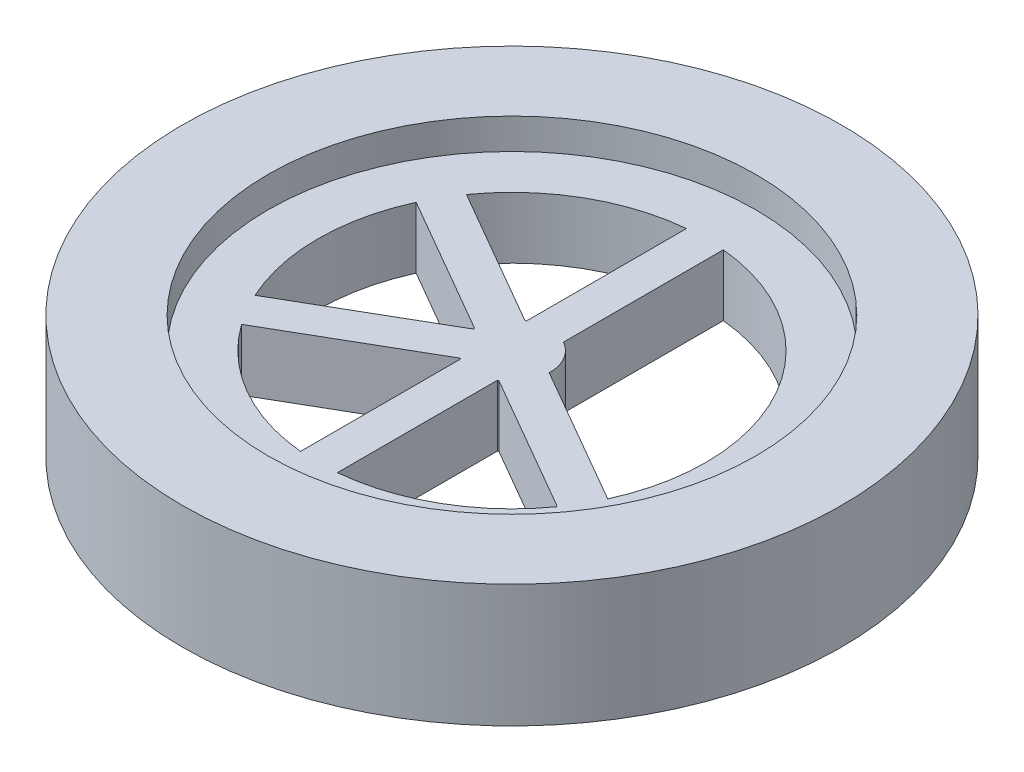
ISO-10303-21;
HEADER;
FILE_DESCRIPTION(('STEP AP214'),'2;1');
FILE_NAME('part.step','',(''),(''),'','','');
FILE_SCHEMA(('AUTOMOTIVE_DESIGN { 1 0 10303 214 1 1 1 1 }'));
ENDSEC;
DATA;
#1=APPLICATION_CONTEXT('core data for automotive mechanical design processes');
#2=APPLICATION_PROTOCOL_DEFINITION('international standard','automotive_design',2000,#1);
#3=PRODUCT_CONTEXT('',#1,'mechanical');
#4=PRODUCT('Part','Part','',(#3));
#5=PRODUCT_RELATED_PRODUCT_CATEGORY('part','',(#4));
#6=PRODUCT_DEFINITION_FORMATION('','',#4);
#7=PRODUCT_DEFINITION_CONTEXT('part definition',#1,'design');
#8=PRODUCT_DEFINITION('design','',#6,#7);
#9=PRODUCT_DEFINITION_SHAPE('','',#8);
#10=(LENGTH_UNIT() NAMED_UNIT(*) SI_UNIT(.MILLI.,.METRE.));
#11=(NAMED_UNIT(*) PLANE_ANGLE_UNIT() SI_UNIT($,.RADIAN.));
#12=(NAMED_UNIT(*) SI_UNIT($,.STERADIAN.) SOLID_ANGLE_UNIT());
#13=UNCERTAINTY_MEASURE_WITH_UNIT(LENGTH_MEASURE(1.E-05),#10,'distance_accuracy_value','');
#14=(GEOMETRIC_REPRESENTATION_CONTEXT(3) GLOBAL_UNCERTAINTY_ASSIGNED_CONTEXT((#13)) GLOBAL_UNIT_ASSIGNED_CONTEXT((#10,
#11,#12)) REPRESENTATION_CONTEXT('',''));
#15=CARTESIAN_POINT('',(0.,0.,0.));
#16=DIRECTION('',(0.,0.,1.));
#17=DIRECTION('',(1.,0.,0.));
#18=AXIS2_PLACEMENT_3D('',#15,#16,#17);
#19=CARTESIAN_POINT('',(0.,5.,0.));
#20=DIRECTION('',(0.,-1.,0.));
#21=DIRECTION('',(0.,0.,-1.));
#22=AXIS2_PLACEMENT_3D('',#19,#20,#21);
#23=CYLINDRICAL_SURFACE('',#22,31.5845753104006);
#24=CARTESIAN_POINT('',(0.,5.,0.));
#25=DIRECTION('',(0.,1.,0.));
#26=DIRECTION('',(0.,0.,1.));
#27=AXIS2_PLACEMENT_3D('',#24,#25,#26);
#28=CIRCLE('',#27,31.5845753104006);
#29=CARTESIAN_POINT('',(-3.,5.,-31.4417779004045));
#30=VERTEX_POINT('',#29);
#31=CARTESIAN_POINT('',(-25.7293784018985,5.,-18.3189651615555));
#32=VERTEX_POINT('',#31);
#33=EDGE_CURVE('E303',#30,#32,#28,.T.);
#34=ORIENTED_EDGE('',*,*,#33,.T.);
#35=DIRECTION('',(0.,-1.,0.));
#36=VECTOR('',#35,1.);
#37=CARTESIAN_POINT('',(-25.7293784018985,5.,-18.3189651615555));
#38=LINE('',#37,#36);
#39=CARTESIAN_POINT('',(-25.7293784018985,-5.,-18.3189651615555));
#40=VERTEX_POINT('',#39);
#41=EDGE_CURVE('E191',#32,#40,#38,.T.);
#42=ORIENTED_EDGE('',*,*,#41,.T.);
#43=CARTESIAN_POINT('',(0.,-5.,0.));
#44=DIRECTION('',(0.,1.,0.));
#45=DIRECTION('',(0.,0.,1.));
#46=AXIS2_PLACEMENT_3D('',#43,#44,#45);
#47=CIRCLE('',#46,31.5845753104006);
#48=CARTESIAN_POINT('',(-3.,-5.,-31.4417779004045));
#49=VERTEX_POINT('',#48);
#50=EDGE_CURVE('E311',#49,#40,#47,.T.);
#51=ORIENTED_EDGE('',*,*,#50,.F.);
#52=DIRECTION('',(0.,-1.,0.));
#53=VECTOR('',#52,1.);
#54=CARTESIAN_POINT('',(-3.,5.,-31.4417779004045));
#55=LINE('',#54,#53);
#56=EDGE_CURVE('E300',#49,#30,#55,.F.);
#57=ORIENTED_EDGE('',*,*,#56,.T.);
#58=EDGE_LOOP('',(#34,#42,#51,#57));
#59=FACE_BOUND('',#58,.T.);
#60=ADVANCED_FACE('F39',(#59),#23,.F.);
#61=CARTESIAN_POINT('',(-28.7293784018985,-5.,-13.1228127388489));
#62=VERTEX_POINT('',#61);
#63=CARTESIAN_POINT('',(-28.7293784018984,-5.,13.1228127388491));
#64=VERTEX_POINT('',#63);
#65=EDGE_CURVE('E316',#62,#64,#47,.T.);
#66=ORIENTED_EDGE('',*,*,#65,.F.);
#67=DIRECTION('',(0.,-1.,0.));
#68=VECTOR('',#67,1.);
#69=CARTESIAN_POINT('',(-28.7293784018985,5.,-13.1228127388489));
#70=LINE('',#69,#68);
#71=CARTESIAN_POINT('',(-28.7293784018985,5.,-13.1228127388489));
#72=VERTEX_POINT('',#71);
#73=EDGE_CURVE('E273',#62,#72,#70,.F.);
#74=ORIENTED_EDGE('',*,*,#73,.T.);
#75=CARTESIAN_POINT('',(-28.7293784018984,5.,13.1228127388491));
#76=VERTEX_POINT('',#75);
#77=EDGE_CURVE('E306',#72,#76,#28,.T.);
#78=ORIENTED_EDGE('',*,*,#77,.T.);
#79=DIRECTION('',(0.,-1.,0.));
#80=VECTOR('',#79,1.);
#81=CARTESIAN_POINT('',(-28.7293784018984,5.,13.1228127388491));
#82=LINE('',#81,#80);
#83=EDGE_CURVE('E266',#76,#64,#82,.T.);
#84=ORIENTED_EDGE('',*,*,#83,.T.);
#85=EDGE_LOOP('',(#66,#74,#78,#84));
#86=FACE_BOUND('',#85,.T.);
#87=ADVANCED_FACE('F344',(#86),#23,.F.);
#88=CARTESIAN_POINT('',(-25.7293784018984,5.,18.3189651615557));
#89=VERTEX_POINT('',#88);
#90=CARTESIAN_POINT('',(-3.,5.,31.4417779004045));
#91=VERTEX_POINT('',#90);
#92=EDGE_CURVE('E664',#89,#91,#28,.T.);
#93=ORIENTED_EDGE('',*,*,#92,.T.);
#94=DIRECTION('',(0.,-1.,0.));
#95=VECTOR('',#94,1.);
#96=CARTESIAN_POINT('',(-3.,5.,31.4417779004045));
#97=LINE('',#96,#95);
#98=CARTESIAN_POINT('',(-3.,-5.,31.4417779004045));
#99=VERTEX_POINT('',#98);
#100=EDGE_CURVE('E271',#91,#99,#97,.T.);
#101=ORIENTED_EDGE('',*,*,#100,.T.);
#102=CARTESIAN_POINT('',(-25.7293784018984,-5.,18.3189651615557));
#103=VERTEX_POINT('',#102);
#104=EDGE_CURVE('E375',#103,#99,#47,.T.);
#105=ORIENTED_EDGE('',*,*,#104,.F.);
#106=DIRECTION('',(0.,-1.,0.));
#107=VECTOR('',#106,1.);
#108=CARTESIAN_POINT('',(-25.7293784018984,5.,18.3189651615557));
#109=LINE('',#108,#107);
#110=EDGE_CURVE('E263',#103,#89,#109,.F.);
#111=ORIENTED_EDGE('',*,*,#110,.T.);
#112=EDGE_LOOP('',(#93,#101,#105,#111));
#113=FACE_BOUND('',#112,.T.);
#114=ADVANCED_FACE('F352',(#113),#23,.F.);
#115=CARTESIAN_POINT('',(3.,-5.,31.4417779004045));
#116=VERTEX_POINT('',#115);
#117=CARTESIAN_POINT('',(25.7293784018987,-5.,18.3189651615553));
#118=VERTEX_POINT('',#117);
#119=EDGE_CURVE('E367',#116,#118,#47,.T.);
#120=ORIENTED_EDGE('',*,*,#119,.F.);
#121=DIRECTION('',(0.,-1.,0.));
#122=VECTOR('',#121,1.);
#123=CARTESIAN_POINT('',(3.,5.,31.4417779004045));
#124=LINE('',#123,#122);
#125=CARTESIAN_POINT('',(3.,5.,31.4417779004045));
#126=VERTEX_POINT('',#125);
#127=EDGE_CURVE('E267',#116,#126,#124,.F.);
#128=ORIENTED_EDGE('',*,*,#127,.T.);
#129=CARTESIAN_POINT('',(25.7293784018987,5.,18.3189651615553));
#130=VERTEX_POINT('',#129);
#131=EDGE_CURVE('E665',#126,#130,#28,.T.);
#132=ORIENTED_EDGE('',*,*,#131,.T.);
#133=DIRECTION('',(0.,-1.,0.));
#134=VECTOR('',#133,1.);
#135=CARTESIAN_POINT('',(25.7293784018987,5.,18.3189651615553));
#136=LINE('',#135,#134);
#137=EDGE_CURVE('E257',#130,#118,#136,.T.);
#138=ORIENTED_EDGE('',*,*,#137,.T.);
#139=EDGE_LOOP('',(#120,#128,#132,#138));
#140=FACE_BOUND('',#139,.T.);
#141=ADVANCED_FACE('F357',(#140),#23,.F.);
#142=CARTESIAN_POINT('',(28.7293784018986,-5.,13.1228127388487));
#143=VERTEX_POINT('',#142);
#144=CARTESIAN_POINT('',(3.,-5.,-31.4417779004045));
#145=VERTEX_POINT('',#144);
#146=EDGE_CURVE('E302',#143,#145,#47,.T.);
#147=ORIENTED_EDGE('',*,*,#146,.F.);
#148=DIRECTION('',(0.,-1.,0.));
#149=VECTOR('',#148,1.);
#150=CARTESIAN_POINT('',(28.7293784018986,5.,13.1228127388487));
#151=LINE('',#150,#149);
#152=CARTESIAN_POINT('',(28.7293784018986,5.,13.1228127388487));
#153=VERTEX_POINT('',#152);
#154=EDGE_CURVE('E199',#143,#153,#151,.F.);
#155=ORIENTED_EDGE('',*,*,#154,.T.);
#156=CARTESIAN_POINT('',(3.,5.,-31.4417779004045));
#157=VERTEX_POINT('',#156);
#158=EDGE_CURVE('E310',#153,#157,#28,.T.);
#159=ORIENTED_EDGE('',*,*,#158,.T.);
#160=DIRECTION('',(0.,-1.,0.));
#161=VECTOR('',#160,1.);
#162=CARTESIAN_POINT('',(3.,5.,-31.4417779004045));
#163=LINE('',#162,#161);
#164=EDGE_CURVE('E299',#157,#145,#163,.T.);
#165=ORIENTED_EDGE('',*,*,#164,.T.);
#166=EDGE_LOOP('',(#147,#155,#159,#165));
#167=FACE_BOUND('',#166,.T.);
#168=ADVANCED_FACE('F346',(#167),#23,.F.);
#169=CARTESIAN_POINT('',(0.,5.,0.));
#170=DIRECTION('',(0.,-1.,0.));
#171=DIRECTION('',(0.,0.,-1.));
#172=AXIS2_PLACEMENT_3D('',#169,#170,#171);
#173=CYLINDRICAL_SURFACE('',#172,6.16611846117728);
#174=DIRECTION('',(0.,-1.,0.));
#175=VECTOR('',#174,1.);
#176=CARTESIAN_POINT('',(3.16537915479053,5.,5.29163412224323));
#177=LINE('',#176,#175);
#178=CARTESIAN_POINT('',(3.16537915479053,5.,5.29163412224323));
#179=VERTEX_POINT('',#178);
#180=CARTESIAN_POINT('',(3.16537915479053,-5.,5.29163412224323));
#181=VERTEX_POINT('',#180);
#182=EDGE_CURVE('E197',#179,#181,#177,.T.);
#183=ORIENTED_EDGE('',*,*,#182,.F.);
#184=CARTESIAN_POINT('',(0.,5.,0.));
#185=DIRECTION('',(0.,1.,0.));
#186=DIRECTION('',(0.,0.,1.));
#187=AXIS2_PLACEMENT_3D('',#184,#185,#186);
#188=CIRCLE('',#187,6.16611846117728);
#189=CARTESIAN_POINT('',(3.,5.,5.3871158217799));
#190=VERTEX_POINT('',#189);
#191=EDGE_CURVE('E398',#190,#179,#188,.T.);
#192=ORIENTED_EDGE('',*,*,#191,.F.);
#193=DIRECTION('',(0.,-1.,0.));
#194=VECTOR('',#193,1.);
#195=CARTESIAN_POINT('',(3.,5.,5.3871158217799));
#196=LINE('',#195,#194);
#197=CARTESIAN_POINT('',(3.,-5.,5.3871158217799));
#198=VERTEX_POINT('',#197);
#199=EDGE_CURVE('E220',#190,#198,#196,.T.);
#200=ORIENTED_EDGE('',*,*,#199,.T.);
#201=CARTESIAN_POINT('',(0.,-5.,0.));
#202=DIRECTION('',(0.,1.,0.));
#203=DIRECTION('',(0.,0.,1.));
#204=AXIS2_PLACEMENT_3D('',#201,#202,#203);
#205=CIRCLE('',#204,6.16611846117728);
#206=EDGE_CURVE('E189',#198,#181,#205,.T.);
#207=ORIENTED_EDGE('',*,*,#206,.T.);
#208=EDGE_LOOP('',(#183,#192,#200,#207));
#209=FACE_BOUND('',#208,.T.);
#210=ADVANCED_FACE('F360',(#209),#173,.T.);
#211=DIRECTION('',(0.,-1.,0.));
#212=VECTOR('',#211,1.);
#213=CARTESIAN_POINT('',(-3.,5.,5.3871158217799));
#214=LINE('',#213,#212);
#215=CARTESIAN_POINT('',(-3.,5.,5.3871158217799));
#216=VERTEX_POINT('',#215);
#217=CARTESIAN_POINT('',(-3.,-5.,5.3871158217799));
#218=VERTEX_POINT('',#217);
#219=EDGE_CURVE('E225',#216,#218,#214,.T.);
#220=ORIENTED_EDGE('',*,*,#219,.F.);
#221=CARTESIAN_POINT('',(-3.16537915479045,5.,5.29163412224328));
#222=VERTEX_POINT('',#221);
#223=EDGE_CURVE('E400',#222,#216,#188,.T.);
#224=ORIENTED_EDGE('',*,*,#223,.F.);
#225=DIRECTION('',(0.,-1.,0.));
#226=VECTOR('',#225,1.);
#227=CARTESIAN_POINT('',(-3.16537915479045,5.,5.29163412224328));
#228=LINE('',#227,#226);
#229=CARTESIAN_POINT('',(-3.16537915479045,-5.,5.29163412224328));
#230=VERTEX_POINT('',#229);
#231=EDGE_CURVE('E232',#222,#230,#228,.T.);
#232=ORIENTED_EDGE('',*,*,#231,.T.);
#233=EDGE_CURVE('E657',#230,#218,#205,.T.);
#234=ORIENTED_EDGE('',*,*,#233,.T.);
#235=EDGE_LOOP('',(#220,#224,#232,#234));
#236=FACE_BOUND('',#235,.T.);
#237=ADVANCED_FACE('F365',(#236),#173,.T.);
#238=DIRECTION('',(0.,-1.,0.));
#239=VECTOR('',#238,1.);
#240=CARTESIAN_POINT('',(-6.16537915479047,5.,0.0954816995366644));
#241=LINE('',#240,#239);
#242=CARTESIAN_POINT('',(-6.16537915479047,5.,0.0954816995366644));
#243=VERTEX_POINT('',#242);
#244=CARTESIAN_POINT('',(-6.16537915479047,-5.,0.0954816995366644));
#245=VERTEX_POINT('',#244);
#246=EDGE_CURVE('E239',#243,#245,#241,.T.);
#247=ORIENTED_EDGE('',*,*,#246,.F.);
#248=CARTESIAN_POINT('',(-6.16537915479047,5.,-0.0954816995366171));
#249=VERTEX_POINT('',#248);
#250=EDGE_CURVE('E282',#249,#243,#188,.T.);
#251=ORIENTED_EDGE('',*,*,#250,.F.);
#252=DIRECTION('',(0.,-1.,0.));
#253=VECTOR('',#252,1.);
#254=CARTESIAN_POINT('',(-6.16537915479047,5.,-0.0954816995366171));
#255=LINE('',#254,#253);
#256=CARTESIAN_POINT('',(-6.16537915479047,-5.,-0.0954816995366171));
#257=VERTEX_POINT('',#256);
#258=EDGE_CURVE('E249',#249,#257,#255,.T.);
#259=ORIENTED_EDGE('',*,*,#258,.T.);
#260=EDGE_CURVE('E288',#257,#245,#205,.T.);
#261=ORIENTED_EDGE('',*,*,#260,.T.);
#262=EDGE_LOOP('',(#247,#251,#259,#261));
#263=FACE_BOUND('',#262,.T.);
#264=ADVANCED_FACE('F542',(#263),#173,.T.);
#265=DIRECTION('',(0.,-1.,0.));
#266=VECTOR('',#265,1.);
#267=CARTESIAN_POINT('',(-3.16537915479049,5.,-5.29163412224326));
#268=LINE('',#267,#266);
#269=CARTESIAN_POINT('',(-3.16537915479049,5.,-5.29163412224326));
#270=VERTEX_POINT('',#269);
#271=CARTESIAN_POINT('',(-3.16537915479049,-5.,-5.29163412224326));
#272=VERTEX_POINT('',#271);
#273=EDGE_CURVE('E258',#270,#272,#268,.T.);
#274=ORIENTED_EDGE('',*,*,#273,.F.);
#275=CARTESIAN_POINT('',(-3.,5.,-5.3871158217799));
#276=VERTEX_POINT('',#275);
#277=EDGE_CURVE('E276',#276,#270,#188,.T.);
#278=ORIENTED_EDGE('',*,*,#277,.F.);
#279=DIRECTION('',(0.,-1.,0.));
#280=VECTOR('',#279,1.);
#281=CARTESIAN_POINT('',(-3.,5.,-5.3871158217799));
#282=LINE('',#281,#280);
#283=CARTESIAN_POINT('',(-3.,-5.,-5.3871158217799));
#284=VERTEX_POINT('',#283);
#285=EDGE_CURVE('E290',#276,#284,#282,.T.);
#286=ORIENTED_EDGE('',*,*,#285,.T.);
#287=EDGE_CURVE('E192',#284,#272,#205,.T.);
#288=ORIENTED_EDGE('',*,*,#287,.T.);
#289=EDGE_LOOP('',(#274,#278,#286,#288));
#290=FACE_BOUND('',#289,.T.);
#291=ADVANCED_FACE('F417',(#290),#173,.T.);
#292=CARTESIAN_POINT('',(0.,-10.,0.));
#293=DIRECTION('',(0.,1.,0.));
#294=DIRECTION('',(0.,0.,1.));
#295=AXIS2_PLACEMENT_3D('',#292,#293,#294);
#296=CYLINDRICAL_SURFACE('',#295,39.7330933362296);
#297=CARTESIAN_POINT('',(0.,-10.,0.));
#298=DIRECTION('',(0.,1.,0.));
#299=DIRECTION('',(0.,0.,1.));
#300=AXIS2_PLACEMENT_3D('',#297,#298,#299);
#301=CIRCLE('',#300,39.7330933362296);
#302=CARTESIAN_POINT('',(0.,-10.,39.7330933362296));
#303=VERTEX_POINT('',#302);
#304=EDGE_CURVE('E320',#303,#303,#301,.T.);
#305=ORIENTED_EDGE('',*,*,#304,.F.);
#306=EDGE_LOOP('',(#305));
#307=FACE_BOUND('',#306,.T.);
#308=CARTESIAN_POINT('',(0.,-5.,0.));
#309=DIRECTION('',(0.,1.,0.));
#310=DIRECTION('',(0.,0.,1.));
#311=AXIS2_PLACEMENT_3D('',#308,#309,#310);
#312=CIRCLE('',#311,39.7330933362296);
#313=CARTESIAN_POINT('',(0.,-5.,39.7330933362296));
#314=VERTEX_POINT('',#313);
#315=EDGE_CURVE('E11',#314,#314,#312,.F.);
#316=ORIENTED_EDGE('',*,*,#315,.F.);
#317=EDGE_LOOP('',(#316));
#318=FACE_BOUND('',#317,.T.);
#319=ADVANCED_FACE('F341',(#307,#318),#296,.F.);
#320=CARTESIAN_POINT('',(0.,10.,0.));
#321=DIRECTION('',(0.,-1.,0.));
#322=DIRECTION('',(0.,0.,-1.));
#323=AXIS2_PLACEMENT_3D('',#320,#321,#322);
#324=CYLINDRICAL_SURFACE('',#323,53.6953229971302);
#325=CARTESIAN_POINT('',(0.,10.,0.));
#326=DIRECTION('',(0.,1.,0.));
#327=DIRECTION('',(0.,0.,1.));
#328=AXIS2_PLACEMENT_3D('',#325,#326,#327);
#329=CIRCLE('',#328,53.6953229971302);
#330=CARTESIAN_POINT('',(0.,10.,53.6953229971302));
#331=VERTEX_POINT('',#330);
#332=EDGE_CURVE('E50',#331,#331,#329,.T.);
#333=ORIENTED_EDGE('',*,*,#332,.F.);
#334=EDGE_LOOP('',(#333));
#335=FACE_BOUND('',#334,.T.);
#336=CARTESIAN_POINT('',(0.,-10.,0.));
#337=DIRECTION('',(0.,1.,0.));
#338=DIRECTION('',(0.,0.,1.));
#339=AXIS2_PLACEMENT_3D('',#336,#337,#338);
#340=CIRCLE('',#339,53.6953229971302);
#341=CARTESIAN_POINT('',(0.,-10.,53.6953229971302));
#342=VERTEX_POINT('',#341);
#343=EDGE_CURVE('E319',#342,#342,#340,.T.);
#344=ORIENTED_EDGE('',*,*,#343,.T.);
#345=EDGE_LOOP('',(#344));
#346=FACE_BOUND('',#345,.T.);
#347=ADVANCED_FACE('F41',(#335,#346),#324,.T.);
#348=CARTESIAN_POINT('',(0.,10.,0.));
#349=DIRECTION('',(0.,1.,0.));
#350=DIRECTION('',(0.,0.,1.));
#351=AXIS2_PLACEMENT_3D('',#348,#349,#350);
#352=PLANE('',#351);
#353=CARTESIAN_POINT('',(0.,10.,0.));
#354=DIRECTION('',(0.,1.,0.));
#355=DIRECTION('',(0.,0.,1.));
#356=AXIS2_PLACEMENT_3D('',#353,#354,#355);
#357=CIRCLE('',#356,39.7330933362296);
#358=CARTESIAN_POINT('',(0.,10.,39.7330933362296));
#359=VERTEX_POINT('',#358);
#360=EDGE_CURVE('E315',#359,#359,#357,.T.);
#361=ORIENTED_EDGE('',*,*,#360,.F.);
#362=EDGE_LOOP('',(#361));
#363=FACE_BOUND('',#362,.T.);
#364=ORIENTED_EDGE('',*,*,#332,.T.);
#365=EDGE_LOOP('',(#364));
#366=FACE_BOUND('',#365,.T.);
#367=ADVANCED_FACE('F332',(#363,#366),#352,.T.);
#368=CARTESIAN_POINT('',(0.,-10.,0.));
#369=DIRECTION('',(0.,1.,0.));
#370=DIRECTION('',(0.,0.,1.));
#371=AXIS2_PLACEMENT_3D('',#368,#369,#370);
#372=PLANE('',#371);
#373=ORIENTED_EDGE('',*,*,#304,.T.);
#374=EDGE_LOOP('',(#373));
#375=FACE_BOUND('',#374,.T.);
#376=ORIENTED_EDGE('',*,*,#343,.F.);
#377=EDGE_LOOP('',(#376));
#378=FACE_BOUND('',#377,.T.);
#379=ADVANCED_FACE('F327',(#375,#378),#372,.F.);
#380=CARTESIAN_POINT('',(0.,5.,0.));
#381=DIRECTION('',(0.,1.,0.));
#382=DIRECTION('',(0.,0.,1.));
#383=AXIS2_PLACEMENT_3D('',#380,#381,#382);
#384=CIRCLE('',#383,39.7330933362296);
#385=CARTESIAN_POINT('',(0.,5.,39.7330933362296));
#386=VERTEX_POINT('',#385);
#387=EDGE_CURVE('E307',#386,#386,#384,.T.);
#388=ORIENTED_EDGE('',*,*,#387,.F.);
#389=EDGE_LOOP('',(#388));
#390=FACE_BOUND('',#389,.T.);
#391=ORIENTED_EDGE('',*,*,#360,.T.);
#392=EDGE_LOOP('',(#391));
#393=FACE_BOUND('',#392,.T.);
#394=ADVANCED_FACE('F329',(#390,#393),#296,.F.);
#395=CARTESIAN_POINT('',(0.,5.,0.));
#396=DIRECTION('',(0.,1.,0.));
#397=DIRECTION('',(0.,0.,1.));
#398=AXIS2_PLACEMENT_3D('',#395,#396,#397);
#399=PLANE('',#398);
#400=ORIENTED_EDGE('',*,*,#77,.F.);
#401=DIRECTION('',(0.86602540378444,0.,0.499999999999998));
#402=VECTOR('',#401,1.);
#403=CARTESIAN_POINT('',(-6.16537915479047,5.,-0.0954816995366171));
#404=LINE('',#403,#402);
#405=EDGE_CURVE('E246',#72,#249,#404,.T.);
#406=ORIENTED_EDGE('',*,*,#405,.T.);
#407=ORIENTED_EDGE('',*,*,#250,.T.);
#408=DIRECTION('',(-0.866025403784436,0.,0.500000000000004));
#409=VECTOR('',#408,1.);
#410=CARTESIAN_POINT('',(-6.16537915479047,5.,0.0954816995366644));
#411=LINE('',#410,#409);
#412=EDGE_CURVE('E226',#243,#76,#411,.T.);
#413=ORIENTED_EDGE('',*,*,#412,.T.);
#414=EDGE_LOOP('',(#400,#406,#407,#413));
#415=FACE_BOUND('',#414,.T.);
#416=ORIENTED_EDGE('',*,*,#92,.F.);
#417=DIRECTION('',(0.866025403784436,0.,-0.500000000000004));
#418=VECTOR('',#417,1.);
#419=CARTESIAN_POINT('',(-3.16537915479045,5.,5.29163412224328));
#420=LINE('',#419,#418);
#421=EDGE_CURVE('E228',#89,#222,#420,.T.);
#422=ORIENTED_EDGE('',*,*,#421,.T.);
#423=ORIENTED_EDGE('',*,*,#223,.T.);
#424=DIRECTION('',(0.,0.,1.));
#425=VECTOR('',#424,1.);
#426=CARTESIAN_POINT('',(-3.,5.,5.3871158217799));
#427=LINE('',#426,#425);
#428=EDGE_CURVE('E215',#216,#91,#427,.T.);
#429=ORIENTED_EDGE('',*,*,#428,.T.);
#430=EDGE_LOOP('',(#416,#422,#423,#429));
#431=FACE_BOUND('',#430,.T.);
#432=ORIENTED_EDGE('',*,*,#131,.F.);
#433=DIRECTION('',(0.,0.,-1.));
#434=VECTOR('',#433,1.);
#435=CARTESIAN_POINT('',(3.,5.,5.3871158217799));
#436=LINE('',#435,#434);
#437=EDGE_CURVE('E65',#126,#190,#436,.T.);
#438=ORIENTED_EDGE('',*,*,#437,.T.);
#439=ORIENTED_EDGE('',*,*,#191,.T.);
#440=DIRECTION('',(0.866025403784444,0.,0.499999999999991));
#441=VECTOR('',#440,1.);
#442=CARTESIAN_POINT('',(3.16537915479053,5.,5.29163412224323));
#443=LINE('',#442,#441);
#444=EDGE_CURVE('E203',#179,#130,#443,.T.);
#445=ORIENTED_EDGE('',*,*,#444,.T.);
#446=EDGE_LOOP('',(#432,#438,#439,#445));
#447=FACE_BOUND('',#446,.T.);
#448=ORIENTED_EDGE('',*,*,#158,.F.);
#449=DIRECTION('',(-0.866025403784444,0.,-0.499999999999991));
#450=VECTOR('',#449,1.);
#451=CARTESIAN_POINT('',(6.16537915479047,5.,0.0954816995365698));
#452=LINE('',#451,#450);
#453=CARTESIAN_POINT('',(6.16537915479047,5.,0.0954816995365699));
#454=VERTEX_POINT('',#453);
#455=EDGE_CURVE('E53',#153,#454,#452,.T.);
#456=ORIENTED_EDGE('',*,*,#455,.T.);
#457=CARTESIAN_POINT('',(3.,5.,-5.3871158217799));
#458=VERTEX_POINT('',#457);
#459=EDGE_CURVE('E198',#454,#458,#188,.T.);
#460=ORIENTED_EDGE('',*,*,#459,.T.);
#461=DIRECTION('',(0.,0.,-1.));
#462=VECTOR('',#461,1.);
#463=CARTESIAN_POINT('',(3.,5.,-5.3871158217799));
#464=LINE('',#463,#462);
#465=EDGE_CURVE('E285',#458,#157,#464,.T.);
#466=ORIENTED_EDGE('',*,*,#465,.T.);
#467=EDGE_LOOP('',(#448,#456,#460,#466));
#468=FACE_BOUND('',#467,.T.);
#469=DIRECTION('',(-0.86602540378444,0.,-0.499999999999998));
#470=VECTOR('',#469,1.);
#471=CARTESIAN_POINT('',(-3.16537915479049,5.,-5.29163412224326));
#472=LINE('',#471,#470);
#473=EDGE_CURVE('E242',#270,#32,#472,.T.);
#474=ORIENTED_EDGE('',*,*,#473,.T.);
#475=ORIENTED_EDGE('',*,*,#33,.F.);
#476=DIRECTION('',(0.,0.,1.));
#477=VECTOR('',#476,1.);
#478=CARTESIAN_POINT('',(-3.,5.,-5.3871158217799));
#479=LINE('',#478,#477);
#480=EDGE_CURVE('E286',#30,#276,#479,.T.);
#481=ORIENTED_EDGE('',*,*,#480,.T.);
#482=ORIENTED_EDGE('',*,*,#277,.T.);
#483=EDGE_LOOP('',(#474,#475,#481,#482));
#484=FACE_BOUND('',#483,.T.);
#485=ORIENTED_EDGE('',*,*,#387,.T.);
#486=EDGE_LOOP('',(#485));
#487=FACE_BOUND('',#486,.T.);
#488=ADVANCED_FACE('F337',(#415,#431,#447,#468,#484,#487),#399,.T.);
#489=CARTESIAN_POINT('',(0.,-5.,0.));
#490=DIRECTION('',(0.,1.,0.));
#491=DIRECTION('',(0.,0.,1.));
#492=AXIS2_PLACEMENT_3D('',#489,#490,#491);
#493=PLANE('',#492);
#494=DIRECTION('',(0.86602540378444,0.,0.499999999999998));
#495=VECTOR('',#494,1.);
#496=CARTESIAN_POINT('',(-6.16537915479047,-5.,-0.0954816995366171));
#497=LINE('',#496,#495);
#498=EDGE_CURVE('E250',#62,#257,#497,.T.);
#499=ORIENTED_EDGE('',*,*,#498,.F.);
#500=ORIENTED_EDGE('',*,*,#65,.T.);
#501=DIRECTION('',(-0.866025403784436,0.,0.500000000000004));
#502=VECTOR('',#501,1.);
#503=CARTESIAN_POINT('',(-6.16537915479047,-5.,0.0954816995366644));
#504=LINE('',#503,#502);
#505=EDGE_CURVE('E223',#245,#64,#504,.T.);
#506=ORIENTED_EDGE('',*,*,#505,.F.);
#507=ORIENTED_EDGE('',*,*,#260,.F.);
#508=EDGE_LOOP('',(#499,#500,#506,#507));
#509=FACE_BOUND('',#508,.T.);
#510=DIRECTION('',(0.866025403784436,0.,-0.500000000000004));
#511=VECTOR('',#510,1.);
#512=CARTESIAN_POINT('',(-3.16537915479045,-5.,5.29163412224328));
#513=LINE('',#512,#511);
#514=EDGE_CURVE('E229',#103,#230,#513,.T.);
#515=ORIENTED_EDGE('',*,*,#514,.F.);
#516=ORIENTED_EDGE('',*,*,#104,.T.);
#517=DIRECTION('',(0.,0.,1.));
#518=VECTOR('',#517,1.);
#519=CARTESIAN_POINT('',(-3.,-5.,5.3871158217799));
#520=LINE('',#519,#518);
#521=EDGE_CURVE('E211',#218,#99,#520,.T.);
#522=ORIENTED_EDGE('',*,*,#521,.F.);
#523=ORIENTED_EDGE('',*,*,#233,.F.);
#524=EDGE_LOOP('',(#515,#516,#522,#523));
#525=FACE_BOUND('',#524,.T.);
#526=DIRECTION('',(0.,0.,-1.));
#527=VECTOR('',#526,1.);
#528=CARTESIAN_POINT('',(3.,-5.,5.3871158217799));
#529=LINE('',#528,#527);
#530=EDGE_CURVE('E214',#116,#198,#529,.T.);
#531=ORIENTED_EDGE('',*,*,#530,.F.);
#532=ORIENTED_EDGE('',*,*,#119,.T.);
#533=DIRECTION('',(0.866025403784444,0.,0.499999999999991));
#534=VECTOR('',#533,1.);
#535=CARTESIAN_POINT('',(3.16537915479053,-5.,5.29163412224323));
#536=LINE('',#535,#534);
#537=EDGE_CURVE('E205',#181,#118,#536,.T.);
#538=ORIENTED_EDGE('',*,*,#537,.F.);
#539=ORIENTED_EDGE('',*,*,#206,.F.);
#540=EDGE_LOOP('',(#531,#532,#538,#539));
#541=FACE_BOUND('',#540,.T.);
#542=DIRECTION('',(-0.866025403784444,0.,-0.499999999999991));
#543=VECTOR('',#542,1.);
#544=CARTESIAN_POINT('',(6.16537915479047,-5.,0.0954816995365698));
#545=LINE('',#544,#543);
#546=CARTESIAN_POINT('',(6.16537915479047,-5.,0.0954816995365698));
#547=VERTEX_POINT('',#546);
#548=EDGE_CURVE('E181',#143,#547,#545,.T.);
#549=ORIENTED_EDGE('',*,*,#548,.F.);
#550=ORIENTED_EDGE('',*,*,#146,.T.);
#551=DIRECTION('',(0.,0.,-1.));
#552=VECTOR('',#551,1.);
#553=CARTESIAN_POINT('',(3.,-5.,-5.3871158217799));
#554=LINE('',#553,#552);
#555=CARTESIAN_POINT('',(3.,-5.,-5.3871158217799));
#556=VERTEX_POINT('',#555);
#557=EDGE_CURVE('E186',#556,#145,#554,.T.);
#558=ORIENTED_EDGE('',*,*,#557,.F.);
#559=EDGE_CURVE('E177',#547,#556,#205,.T.);
#560=ORIENTED_EDGE('',*,*,#559,.F.);
#561=EDGE_LOOP('',(#549,#550,#558,#560));
#562=FACE_BOUND('',#561,.T.);
#563=ORIENTED_EDGE('',*,*,#315,.T.);
#564=EDGE_LOOP('',(#563));
#565=FACE_BOUND('',#564,.T.);
#566=ORIENTED_EDGE('',*,*,#50,.T.);
#567=DIRECTION('',(-0.86602540378444,0.,-0.499999999999998));
#568=VECTOR('',#567,1.);
#569=CARTESIAN_POINT('',(-3.16537915479049,-5.,-5.29163412224326));
#570=LINE('',#569,#568);
#571=EDGE_CURVE('E245',#272,#40,#570,.T.);
#572=ORIENTED_EDGE('',*,*,#571,.F.);
#573=ORIENTED_EDGE('',*,*,#287,.F.);
#574=DIRECTION('',(0.,0.,1.));
#575=VECTOR('',#574,1.);
#576=CARTESIAN_POINT('',(-3.,-5.,-5.3871158217799));
#577=LINE('',#576,#575);
#578=EDGE_CURVE('E292',#49,#284,#577,.T.);
#579=ORIENTED_EDGE('',*,*,#578,.F.);
#580=EDGE_LOOP('',(#566,#572,#573,#579));
#581=FACE_BOUND('',#580,.T.);
#582=ADVANCED_FACE('F179',(#509,#525,#541,#562,#565,#581),#493,.F.);
#583=ORIENTED_EDGE('',*,*,#459,.F.);
#584=DIRECTION('',(0.,-1.,0.));
#585=VECTOR('',#584,1.);
#586=CARTESIAN_POINT('',(6.16537915479047,5.,0.0954816995365698));
#587=LINE('',#586,#585);
#588=EDGE_CURVE('E193',#454,#547,#587,.T.);
#589=ORIENTED_EDGE('',*,*,#588,.T.);
#590=ORIENTED_EDGE('',*,*,#559,.T.);
#591=DIRECTION('',(0.,-1.,0.));
#592=VECTOR('',#591,1.);
#593=CARTESIAN_POINT('',(3.,5.,-5.3871158217799));
#594=LINE('',#593,#592);
#595=EDGE_CURVE('E293',#458,#556,#594,.T.);
#596=ORIENTED_EDGE('',*,*,#595,.F.);
#597=EDGE_LOOP('',(#583,#589,#590,#596));
#598=FACE_BOUND('',#597,.T.);
#599=ADVANCED_FACE('F194',(#598),#173,.T.);
#600=CARTESIAN_POINT('',(3.,5.,-5.3871158217799));
#601=DIRECTION('',(-1.,0.,0.));
#602=DIRECTION('',(0.,0.,1.));
#603=AXIS2_PLACEMENT_3D('',#600,#601,#602);
#604=PLANE('',#603);
#605=ORIENTED_EDGE('',*,*,#164,.F.);
#606=ORIENTED_EDGE('',*,*,#465,.F.);
#607=ORIENTED_EDGE('',*,*,#595,.T.);
#608=ORIENTED_EDGE('',*,*,#557,.T.);
#609=EDGE_LOOP('',(#605,#606,#607,#608));
#610=FACE_BOUND('',#609,.T.);
#611=ADVANCED_FACE('F407',(#610),#604,.F.);
#612=CARTESIAN_POINT('',(-3.,5.,-5.3871158217799));
#613=DIRECTION('',(1.,0.,0.));
#614=DIRECTION('',(0.,0.,-1.));
#615=AXIS2_PLACEMENT_3D('',#612,#613,#614);
#616=PLANE('',#615);
#617=ORIENTED_EDGE('',*,*,#56,.F.);
#618=ORIENTED_EDGE('',*,*,#578,.T.);
#619=ORIENTED_EDGE('',*,*,#285,.F.);
#620=ORIENTED_EDGE('',*,*,#480,.F.);
#621=EDGE_LOOP('',(#617,#618,#619,#620));
#622=FACE_BOUND('',#621,.T.);
#623=ADVANCED_FACE('F408',(#622),#616,.F.);
#624=CARTESIAN_POINT('',(3.,5.,5.3871158217799));
#625=DIRECTION('',(-1.,0.,0.));
#626=DIRECTION('',(0.,0.,1.));
#627=AXIS2_PLACEMENT_3D('',#624,#625,#626);
#628=PLANE('',#627);
#629=ORIENTED_EDGE('',*,*,#127,.F.);
#630=ORIENTED_EDGE('',*,*,#530,.T.);
#631=ORIENTED_EDGE('',*,*,#199,.F.);
#632=ORIENTED_EDGE('',*,*,#437,.F.);
#633=EDGE_LOOP('',(#629,#630,#631,#632));
#634=FACE_BOUND('',#633,.T.);
#635=ADVANCED_FACE('F412',(#634),#628,.F.);
#636=CARTESIAN_POINT('',(-3.,5.,5.3871158217799));
#637=DIRECTION('',(1.,0.,0.));
#638=DIRECTION('',(0.,0.,-1.));
#639=AXIS2_PLACEMENT_3D('',#636,#637,#638);
#640=PLANE('',#639);
#641=ORIENTED_EDGE('',*,*,#100,.F.);
#642=ORIENTED_EDGE('',*,*,#428,.F.);
#643=ORIENTED_EDGE('',*,*,#219,.T.);
#644=ORIENTED_EDGE('',*,*,#521,.T.);
#645=EDGE_LOOP('',(#641,#642,#643,#644));
#646=FACE_BOUND('',#645,.T.);
#647=ADVANCED_FACE('F438',(#646),#640,.F.);
#648=CARTESIAN_POINT('',(-3.16537915479045,5.,5.29163412224328));
#649=DIRECTION('',(-0.500000000000004,0.,-0.866025403784436));
#650=DIRECTION('',(-0.866025403784436,0.,0.500000000000004));
#651=AXIS2_PLACEMENT_3D('',#648,#649,#650);
#652=PLANE('',#651);
#653=ORIENTED_EDGE('',*,*,#110,.F.);
#654=ORIENTED_EDGE('',*,*,#514,.T.);
#655=ORIENTED_EDGE('',*,*,#231,.F.);
#656=ORIENTED_EDGE('',*,*,#421,.F.);
#657=EDGE_LOOP('',(#653,#654,#655,#656));
#658=FACE_BOUND('',#657,.T.);
#659=ADVANCED_FACE('F450',(#658),#652,.F.);
#660=CARTESIAN_POINT('',(-6.16537915479047,5.,0.0954816995366644));
#661=DIRECTION('',(0.500000000000004,0.,0.866025403784436));
#662=DIRECTION('',(0.866025403784436,0.,-0.500000000000004));
#663=AXIS2_PLACEMENT_3D('',#660,#661,#662);
#664=PLANE('',#663);
#665=ORIENTED_EDGE('',*,*,#83,.F.);
#666=ORIENTED_EDGE('',*,*,#412,.F.);
#667=ORIENTED_EDGE('',*,*,#246,.T.);
#668=ORIENTED_EDGE('',*,*,#505,.T.);
#669=EDGE_LOOP('',(#665,#666,#667,#668));
#670=FACE_BOUND('',#669,.T.);
#671=ADVANCED_FACE('F391',(#670),#664,.F.);
#672=CARTESIAN_POINT('',(-6.16537915479047,5.,-0.0954816995366171));
#673=DIRECTION('',(0.499999999999998,0.,-0.86602540378444));
#674=DIRECTION('',(-0.86602540378444,0.,-0.499999999999998));
#675=AXIS2_PLACEMENT_3D('',#672,#673,#674);
#676=PLANE('',#675);
#677=ORIENTED_EDGE('',*,*,#73,.F.);
#678=ORIENTED_EDGE('',*,*,#498,.T.);
#679=ORIENTED_EDGE('',*,*,#258,.F.);
#680=ORIENTED_EDGE('',*,*,#405,.F.);
#681=EDGE_LOOP('',(#677,#678,#679,#680));
#682=FACE_BOUND('',#681,.T.);
#683=ADVANCED_FACE('F463',(#682),#676,.F.);
#684=CARTESIAN_POINT('',(-3.16537915479049,5.,-5.29163412224326));
#685=DIRECTION('',(-0.499999999999998,0.,0.86602540378444));
#686=DIRECTION('',(0.86602540378444,0.,0.499999999999998));
#687=AXIS2_PLACEMENT_3D('',#684,#685,#686);
#688=PLANE('',#687);
#689=ORIENTED_EDGE('',*,*,#41,.F.);
#690=ORIENTED_EDGE('',*,*,#473,.F.);
#691=ORIENTED_EDGE('',*,*,#273,.T.);
#692=ORIENTED_EDGE('',*,*,#571,.T.);
#693=EDGE_LOOP('',(#689,#690,#691,#692));
#694=FACE_BOUND('',#693,.T.);
#695=ADVANCED_FACE('F472',(#694),#688,.F.);
#696=CARTESIAN_POINT('',(3.16537915479053,5.,5.29163412224323));
#697=DIRECTION('',(0.499999999999991,0.,-0.866025403784444));
#698=DIRECTION('',(-0.866025403784444,0.,-0.499999999999991));
#699=AXIS2_PLACEMENT_3D('',#696,#697,#698);
#700=PLANE('',#699);
#701=ORIENTED_EDGE('',*,*,#137,.F.);
#702=ORIENTED_EDGE('',*,*,#444,.F.);
#703=ORIENTED_EDGE('',*,*,#182,.T.);
#704=ORIENTED_EDGE('',*,*,#537,.T.);
#705=EDGE_LOOP('',(#701,#702,#703,#704));
#706=FACE_BOUND('',#705,.T.);
#707=ADVANCED_FACE('F481',(#706),#700,.F.);
#708=CARTESIAN_POINT('',(6.16537915479047,5.,0.0954816995365698));
#709=DIRECTION('',(-0.499999999999991,0.,0.866025403784444));
#710=DIRECTION('',(0.866025403784444,0.,0.499999999999991));
#711=AXIS2_PLACEMENT_3D('',#708,#709,#710);
#712=PLANE('',#711);
#713=ORIENTED_EDGE('',*,*,#154,.F.);
#714=ORIENTED_EDGE('',*,*,#548,.T.);
#715=ORIENTED_EDGE('',*,*,#588,.F.);
#716=ORIENTED_EDGE('',*,*,#455,.F.);
#717=EDGE_LOOP('',(#713,#714,#715,#716));
#718=FACE_BOUND('',#717,.T.);
#719=ADVANCED_FACE('F200',(#718),#712,.F.);
#720=CLOSED_SHELL('',(#60,#87,#114,#141,#168,#210,#237,#264,#291,#319,#347,#367,#379,#394,#488,
#582,#599,#611,#623,#635,#647,#659,#671,#683,#695,#707,#719));
#721=MANIFOLD_SOLID_BREP('B2',#720);
#722=ADVANCED_BREP_SHAPE_REPRESENTATION('',(#18,#721),#14);
#723=SHAPE_DEFINITION_REPRESENTATION(#9,#722);
ENDSEC;
END-ISO-10303-21;
